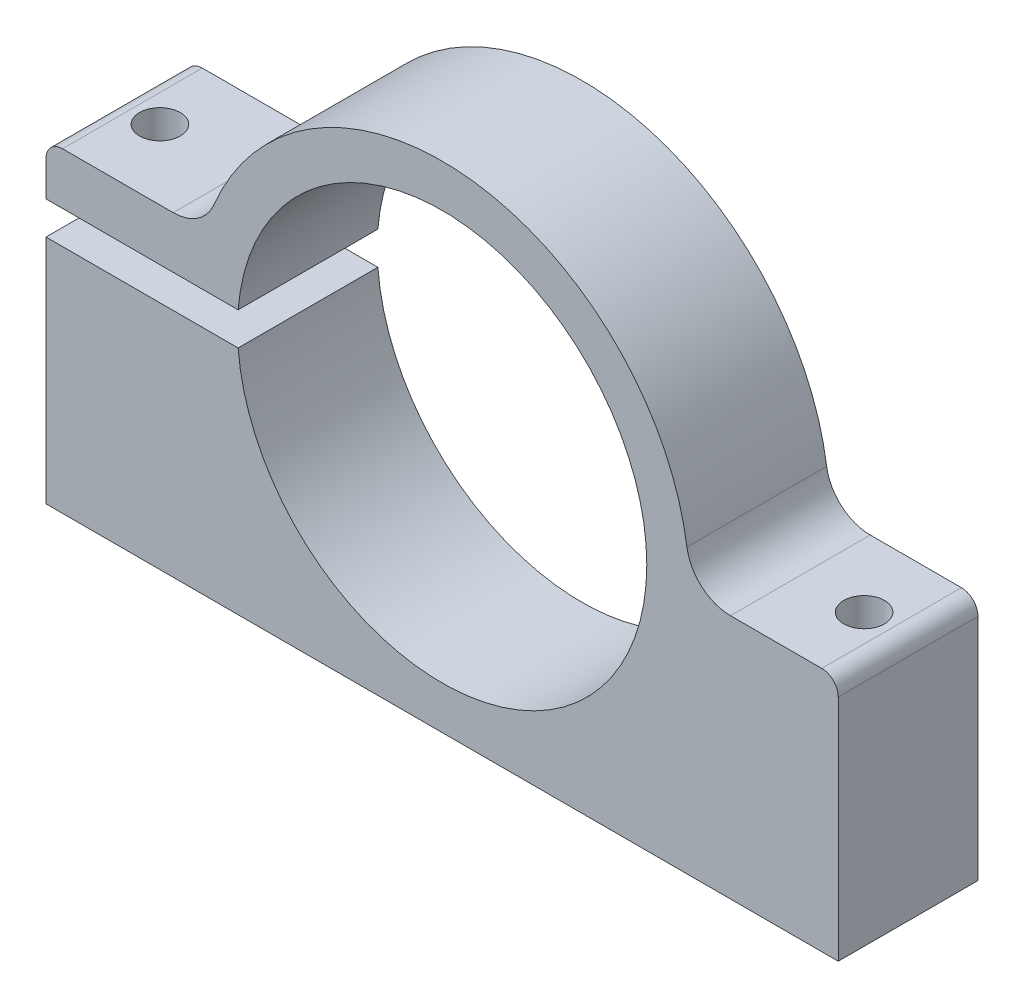
ISO-10303-21;
HEADER;
FILE_DESCRIPTION(('STEP AP214'),'2;1');
FILE_NAME('part.step','',(''),(''),'','','');
FILE_SCHEMA(('AUTOMOTIVE_DESIGN { 1 0 10303 214 1 1 1 1 }'));
ENDSEC;
DATA;
#1=APPLICATION_CONTEXT('core data for automotive mechanical design processes');
#2=APPLICATION_PROTOCOL_DEFINITION('international standard','automotive_design',2000,#1);
#3=PRODUCT_CONTEXT('',#1,'mechanical');
#4=PRODUCT('Part','Part','',(#3));
#5=PRODUCT_RELATED_PRODUCT_CATEGORY('part','',(#4));
#6=PRODUCT_DEFINITION_FORMATION('','',#4);
#7=PRODUCT_DEFINITION_CONTEXT('part definition',#1,'design');
#8=PRODUCT_DEFINITION('design','',#6,#7);
#9=PRODUCT_DEFINITION_SHAPE('','',#8);
#10=(LENGTH_UNIT() NAMED_UNIT(*) SI_UNIT(.MILLI.,.METRE.));
#11=(NAMED_UNIT(*) PLANE_ANGLE_UNIT() SI_UNIT($,.RADIAN.));
#12=(NAMED_UNIT(*) SI_UNIT($,.STERADIAN.) SOLID_ANGLE_UNIT());
#13=UNCERTAINTY_MEASURE_WITH_UNIT(LENGTH_MEASURE(1.E-05),#10,'distance_accuracy_value','');
#14=(GEOMETRIC_REPRESENTATION_CONTEXT(3) GLOBAL_UNCERTAINTY_ASSIGNED_CONTEXT((#13)) GLOBAL_UNIT_ASSIGNED_CONTEXT((#10,
#11,#12)) REPRESENTATION_CONTEXT('',''));
#15=CARTESIAN_POINT('',(0.,0.,0.));
#16=DIRECTION('',(0.,0.,1.));
#17=DIRECTION('',(1.,0.,0.));
#18=AXIS2_PLACEMENT_3D('',#15,#16,#17);
#19=CARTESIAN_POINT('',(0.,1.5,-6.35));
#20=DIRECTION('',(0.,1.,0.));
#21=DIRECTION('',(-1.,0.,0.));
#22=AXIS2_PLACEMENT_3D('',#19,#20,#21);
#23=PLANE('',#22);
#24=CARTESIAN_POINT('',(-32.,1.49999999999999,0.));
#25=DIRECTION('',(0.,1.,0.));
#26=DIRECTION('',(-1.,0.,0.));
#27=AXIS2_PLACEMENT_3D('',#24,#25,#26);
#28=CIRCLE('',#27,1.85);
#29=CARTESIAN_POINT('',(-33.85,1.49999999999999,0.));
#30=VERTEX_POINT('',#29);
#31=EDGE_CURVE('E152',#30,#30,#28,.T.);
#32=ORIENTED_EDGE('',*,*,#31,.T.);
#33=EDGE_LOOP('',(#32));
#34=FACE_BOUND('',#33,.T.);
#35=DIRECTION('',(-1.,0.,0.));
#36=VECTOR('',#35,1.);
#37=CARTESIAN_POINT('',(0.,1.5,-6.35));
#38=LINE('',#37,#36);
#39=CARTESIAN_POINT('',(-18.5394174665765,1.5,-6.35));
#40=VERTEX_POINT('',#39);
#41=CARTESIAN_POINT('',(-36.,1.5,-6.35));
#42=VERTEX_POINT('',#41);
#43=EDGE_CURVE('E148',#40,#42,#38,.T.);
#44=ORIENTED_EDGE('',*,*,#43,.F.);
#45=DIRECTION('',(0.,0.,1.));
#46=VECTOR('',#45,1.);
#47=CARTESIAN_POINT('',(-18.5394174665765,1.5,-6.35));
#48=LINE('',#47,#46);
#49=CARTESIAN_POINT('',(-18.5394174665765,1.5,6.35));
#50=VERTEX_POINT('',#49);
#51=EDGE_CURVE('E132',#40,#50,#48,.T.);
#52=ORIENTED_EDGE('',*,*,#51,.T.);
#53=DIRECTION('',(-1.,0.,0.));
#54=VECTOR('',#53,1.);
#55=CARTESIAN_POINT('',(0.,1.5,6.35));
#56=LINE('',#55,#54);
#57=CARTESIAN_POINT('',(-36.,1.5,6.35));
#58=VERTEX_POINT('',#57);
#59=EDGE_CURVE('E187',#50,#58,#56,.T.);
#60=ORIENTED_EDGE('',*,*,#59,.T.);
#61=DIRECTION('',(0.,0.,1.));
#62=VECTOR('',#61,1.);
#63=CARTESIAN_POINT('',(-36.,1.5,-6.35));
#64=LINE('',#63,#62);
#65=EDGE_CURVE('E155',#42,#58,#64,.T.);
#66=ORIENTED_EDGE('',*,*,#65,.F.);
#67=EDGE_LOOP('',(#44,#52,#60,#66));
#68=FACE_BOUND('',#67,.T.);
#69=ADVANCED_FACE('F32',(#34,#68),#23,.F.);
#70=CARTESIAN_POINT('',(-36.,1.5,-6.35));
#71=DIRECTION('',(1.,0.,0.));
#72=DIRECTION('',(0.,0.,-1.));
#73=AXIS2_PLACEMENT_3D('',#70,#71,#72);
#74=PLANE('',#73);
#75=DIRECTION('',(0.,1.,0.));
#76=VECTOR('',#75,1.);
#77=CARTESIAN_POINT('',(-36.,1.5,6.35));
#78=LINE('',#77,#76);
#79=CARTESIAN_POINT('',(-36.,4.69999999999999,6.35));
#80=VERTEX_POINT('',#79);
#81=EDGE_CURVE('E184',#58,#80,#78,.T.);
#82=ORIENTED_EDGE('',*,*,#81,.T.);
#83=DIRECTION('',(0.,0.,1.));
#84=VECTOR('',#83,1.);
#85=CARTESIAN_POINT('',(-36.,4.69999999999999,-6.35));
#86=LINE('',#85,#84);
#87=CARTESIAN_POINT('',(-36.,4.69999999999999,-6.35));
#88=VERTEX_POINT('',#87);
#89=EDGE_CURVE('E226',#80,#88,#86,.F.);
#90=ORIENTED_EDGE('',*,*,#89,.T.);
#91=DIRECTION('',(0.,1.,0.));
#92=VECTOR('',#91,1.);
#93=CARTESIAN_POINT('',(-36.,1.5,-6.35));
#94=LINE('',#93,#92);
#95=EDGE_CURVE('E158',#42,#88,#94,.T.);
#96=ORIENTED_EDGE('',*,*,#95,.F.);
#97=ORIENTED_EDGE('',*,*,#65,.T.);
#98=EDGE_LOOP('',(#82,#90,#96,#97));
#99=FACE_BOUND('',#98,.T.);
#100=ADVANCED_FACE('F285',(#99),#74,.F.);
#101=CARTESIAN_POINT('',(-36.,6.19999999999999,-6.35));
#102=DIRECTION('',(0.,-1.,0.));
#103=DIRECTION('',(0.,0.,-1.));
#104=AXIS2_PLACEMENT_3D('',#101,#102,#103);
#105=PLANE('',#104);
#106=CARTESIAN_POINT('',(-32.,6.2,0.));
#107=DIRECTION('',(0.,1.,0.));
#108=DIRECTION('',(-1.,0.,0.));
#109=AXIS2_PLACEMENT_3D('',#106,#107,#108);
#110=CIRCLE('',#109,1.85);
#111=CARTESIAN_POINT('',(-33.85,6.2,0.));
#112=VERTEX_POINT('',#111);
#113=EDGE_CURVE('E448',#112,#112,#110,.T.);
#114=ORIENTED_EDGE('',*,*,#113,.F.);
#115=EDGE_LOOP('',(#114));
#116=FACE_BOUND('',#115,.T.);
#117=DIRECTION('',(1.,0.,0.));
#118=VECTOR('',#117,1.);
#119=CARTESIAN_POINT('',(-36.,6.19999999999999,-6.35));
#120=LINE('',#119,#118);
#121=CARTESIAN_POINT('',(-34.5,6.19999999999999,-6.35));
#122=VERTEX_POINT('',#121);
#123=CARTESIAN_POINT('',(-24.4366609830394,6.19999999999999,-6.35));
#124=VERTEX_POINT('',#123);
#125=EDGE_CURVE('E163',#122,#124,#120,.T.);
#126=ORIENTED_EDGE('',*,*,#125,.F.);
#127=DIRECTION('',(0.,0.,1.));
#128=VECTOR('',#127,1.);
#129=CARTESIAN_POINT('',(-34.5,6.19999999999999,-6.35));
#130=LINE('',#129,#128);
#131=CARTESIAN_POINT('',(-34.5,6.19999999999999,6.35));
#132=VERTEX_POINT('',#131);
#133=EDGE_CURVE('E219',#122,#132,#130,.T.);
#134=ORIENTED_EDGE('',*,*,#133,.T.);
#135=DIRECTION('',(1.,0.,0.));
#136=VECTOR('',#135,1.);
#137=CARTESIAN_POINT('',(-36.,6.19999999999999,6.35));
#138=LINE('',#137,#136);
#139=CARTESIAN_POINT('',(-24.4366609830394,6.19999999999999,6.35));
#140=VERTEX_POINT('',#139);
#141=EDGE_CURVE('E182',#132,#140,#138,.T.);
#142=ORIENTED_EDGE('',*,*,#141,.T.);
#143=DIRECTION('',(0.,0.,1.));
#144=VECTOR('',#143,1.);
#145=CARTESIAN_POINT('',(-24.4366609830394,6.19999999999999,-6.35));
#146=LINE('',#145,#144);
#147=EDGE_CURVE('E203',#140,#124,#146,.F.);
#148=ORIENTED_EDGE('',*,*,#147,.T.);
#149=EDGE_LOOP('',(#126,#134,#142,#148));
#150=FACE_BOUND('',#149,.T.);
#151=ADVANCED_FACE('F264',(#116,#150),#105,.F.);
#152=CARTESIAN_POINT('',(0.,0.,-6.35));
#153=DIRECTION('',(0.,0.,1.));
#154=DIRECTION('',(1.,0.,0.));
#155=AXIS2_PLACEMENT_3D('',#152,#153,#154);
#156=CYLINDRICAL_SURFACE('',#155,22.48);
#157=CARTESIAN_POINT('',(0.,0.,-6.35));
#158=DIRECTION('',(0.,0.,1.));
#159=DIRECTION('',(1.,0.,0.));
#160=AXIS2_PLACEMENT_3D('',#157,#158,#159);
#161=CIRCLE('',#160,22.48);
#162=CARTESIAN_POINT('',(22.2473243549501,3.22598187311178,-6.35));
#163=VERTEX_POINT('',#162);
#164=CARTESIAN_POINT('',(-20.745322465964,8.65921450151057,-6.35));
#165=VERTEX_POINT('',#164);
#166=EDGE_CURVE('E250',#163,#165,#161,.T.);
#167=ORIENTED_EDGE('',*,*,#166,.T.);
#168=DIRECTION('',(0.,0.,1.));
#169=VECTOR('',#168,1.);
#170=CARTESIAN_POINT('',(-20.745322465964,8.65921450151057,-6.35));
#171=LINE('',#170,#169);
#172=CARTESIAN_POINT('',(-20.745322465964,8.65921450151057,6.35));
#173=VERTEX_POINT('',#172);
#174=EDGE_CURVE('E200',#165,#173,#171,.T.);
#175=ORIENTED_EDGE('',*,*,#174,.T.);
#176=CARTESIAN_POINT('',(0.,0.,6.35));
#177=DIRECTION('',(0.,0.,1.));
#178=DIRECTION('',(1.,0.,0.));
#179=AXIS2_PLACEMENT_3D('',#176,#177,#178);
#180=CIRCLE('',#179,22.48);
#181=CARTESIAN_POINT('',(22.2473243549501,3.22598187311178,6.35));
#182=VERTEX_POINT('',#181);
#183=EDGE_CURVE('E179',#182,#173,#180,.T.);
#184=ORIENTED_EDGE('',*,*,#183,.F.);
#185=DIRECTION('',(0.,0.,1.));
#186=VECTOR('',#185,1.);
#187=CARTESIAN_POINT('',(22.2473243549501,3.22598187311178,-6.35));
#188=LINE('',#187,#186);
#189=EDGE_CURVE('E194',#182,#163,#188,.F.);
#190=ORIENTED_EDGE('',*,*,#189,.T.);
#191=EDGE_LOOP('',(#167,#175,#184,#190));
#192=FACE_BOUND('',#191,.T.);
#193=ADVANCED_FACE('F270',(#192),#156,.T.);
#194=CARTESIAN_POINT('',(36.,-0.200000000000006,-6.35));
#195=DIRECTION('',(0.,1.,0.));
#196=DIRECTION('',(-1.,0.,0.));
#197=AXIS2_PLACEMENT_3D('',#194,#195,#196);
#198=PLANE('',#197);
#199=CARTESIAN_POINT('',(32.,-0.20000000000001,0.));
#200=DIRECTION('',(0.,1.,0.));
#201=DIRECTION('',(-1.,0.,0.));
#202=AXIS2_PLACEMENT_3D('',#199,#200,#201);
#203=CIRCLE('',#202,1.85);
#204=CARTESIAN_POINT('',(30.15,-0.20000000000001,0.));
#205=VERTEX_POINT('',#204);
#206=EDGE_CURVE('E446',#205,#205,#203,.T.);
#207=ORIENTED_EDGE('',*,*,#206,.F.);
#208=EDGE_LOOP('',(#207));
#209=FACE_BOUND('',#208,.T.);
#210=DIRECTION('',(-1.,0.,0.));
#211=VECTOR('',#210,1.);
#212=CARTESIAN_POINT('',(36.,-0.200000000000006,6.35));
#213=LINE('',#212,#211);
#214=CARTESIAN_POINT('',(34.5,-0.200000000000006,6.35));
#215=VERTEX_POINT('',#214);
#216=CARTESIAN_POINT('',(26.2059229946209,-0.200000000000007,6.35));
#217=VERTEX_POINT('',#216);
#218=EDGE_CURVE('E177',#215,#217,#213,.T.);
#219=ORIENTED_EDGE('',*,*,#218,.F.);
#220=DIRECTION('',(0.,0.,1.));
#221=VECTOR('',#220,1.);
#222=CARTESIAN_POINT('',(34.5,-0.200000000000006,-6.35));
#223=LINE('',#222,#221);
#224=CARTESIAN_POINT('',(34.5,-0.200000000000006,-6.35));
#225=VERTEX_POINT('',#224);
#226=EDGE_CURVE('E11',#215,#225,#223,.F.);
#227=ORIENTED_EDGE('',*,*,#226,.T.);
#228=DIRECTION('',(-1.,0.,0.));
#229=VECTOR('',#228,1.);
#230=CARTESIAN_POINT('',(36.,-0.200000000000006,-6.35));
#231=LINE('',#230,#229);
#232=CARTESIAN_POINT('',(26.2059229946209,-0.200000000000007,-6.35));
#233=VERTEX_POINT('',#232);
#234=EDGE_CURVE('E248',#225,#233,#231,.T.);
#235=ORIENTED_EDGE('',*,*,#234,.T.);
#236=DIRECTION('',(0.,0.,-1.));
#237=VECTOR('',#236,1.);
#238=CARTESIAN_POINT('',(26.2059229946209,-0.200000000000007,6.35));
#239=LINE('',#238,#237);
#240=EDGE_CURVE('E206',#233,#217,#239,.F.);
#241=ORIENTED_EDGE('',*,*,#240,.T.);
#242=EDGE_LOOP('',(#219,#227,#235,#241));
#243=FACE_BOUND('',#242,.T.);
#244=ADVANCED_FACE('F277',(#209,#243),#198,.T.);
#245=CARTESIAN_POINT('',(36.,-22.5,-6.35));
#246=DIRECTION('',(1.,0.,0.));
#247=DIRECTION('',(0.,1.,0.));
#248=AXIS2_PLACEMENT_3D('',#245,#246,#247);
#249=PLANE('',#248);
#250=DIRECTION('',(0.,1.,0.));
#251=VECTOR('',#250,1.);
#252=CARTESIAN_POINT('',(36.,-22.5,-6.35));
#253=LINE('',#252,#251);
#254=CARTESIAN_POINT('',(36.,-22.5,-6.35));
#255=VERTEX_POINT('',#254);
#256=CARTESIAN_POINT('',(36.,-1.70000000000001,-6.35));
#257=VERTEX_POINT('',#256);
#258=EDGE_CURVE('E235',#255,#257,#253,.T.);
#259=ORIENTED_EDGE('',*,*,#258,.T.);
#260=DIRECTION('',(0.,0.,1.));
#261=VECTOR('',#260,1.);
#262=CARTESIAN_POINT('',(36.,-1.70000000000001,-6.35));
#263=LINE('',#262,#261);
#264=CARTESIAN_POINT('',(36.,-1.70000000000001,6.35));
#265=VERTEX_POINT('',#264);
#266=EDGE_CURVE('E40',#257,#265,#263,.T.);
#267=ORIENTED_EDGE('',*,*,#266,.T.);
#268=DIRECTION('',(0.,1.,0.));
#269=VECTOR('',#268,1.);
#270=CARTESIAN_POINT('',(36.,-22.5,6.35));
#271=LINE('',#270,#269);
#272=CARTESIAN_POINT('',(36.,-22.5,6.35));
#273=VERTEX_POINT('',#272);
#274=EDGE_CURVE('E174',#273,#265,#271,.T.);
#275=ORIENTED_EDGE('',*,*,#274,.F.);
#276=DIRECTION('',(0.,0.,1.));
#277=VECTOR('',#276,1.);
#278=CARTESIAN_POINT('',(36.,-22.5,-6.35));
#279=LINE('',#278,#277);
#280=EDGE_CURVE('E190',#255,#273,#279,.T.);
#281=ORIENTED_EDGE('',*,*,#280,.F.);
#282=EDGE_LOOP('',(#259,#267,#275,#281));
#283=FACE_BOUND('',#282,.T.);
#284=ADVANCED_FACE('F234',(#283),#249,.T.);
#285=CARTESIAN_POINT('',(-36.,-22.5,-6.35));
#286=DIRECTION('',(0.,-1.,0.));
#287=DIRECTION('',(0.,0.,-1.));
#288=AXIS2_PLACEMENT_3D('',#285,#286,#287);
#289=PLANE('',#288);
#290=CARTESIAN_POINT('',(32.,-22.5,0.));
#291=DIRECTION('',(0.,1.,0.));
#292=DIRECTION('',(-1.,0.,0.));
#293=AXIS2_PLACEMENT_3D('',#290,#291,#292);
#294=CIRCLE('',#293,1.85);
#295=CARTESIAN_POINT('',(30.15,-22.5,0.));
#296=VERTEX_POINT('',#295);
#297=EDGE_CURVE('E443',#296,#296,#294,.T.);
#298=ORIENTED_EDGE('',*,*,#297,.T.);
#299=EDGE_LOOP('',(#298));
#300=FACE_BOUND('',#299,.T.);
#301=CARTESIAN_POINT('',(-32.,-22.5,0.));
#302=DIRECTION('',(0.,1.,0.));
#303=DIRECTION('',(-1.,0.,0.));
#304=AXIS2_PLACEMENT_3D('',#301,#302,#303);
#305=CIRCLE('',#304,1.85);
#306=CARTESIAN_POINT('',(-33.85,-22.5,0.));
#307=VERTEX_POINT('',#306);
#308=EDGE_CURVE('E198',#307,#307,#305,.T.);
#309=ORIENTED_EDGE('',*,*,#308,.T.);
#310=EDGE_LOOP('',(#309));
#311=FACE_BOUND('',#310,.T.);
#312=DIRECTION('',(1.,0.,0.));
#313=VECTOR('',#312,1.);
#314=CARTESIAN_POINT('',(-36.,-22.5,6.35));
#315=LINE('',#314,#313);
#316=CARTESIAN_POINT('',(-36.,-22.5,6.35));
#317=VERTEX_POINT('',#316);
#318=EDGE_CURVE('E171',#317,#273,#315,.T.);
#319=ORIENTED_EDGE('',*,*,#318,.F.);
#320=DIRECTION('',(0.,0.,1.));
#321=VECTOR('',#320,1.);
#322=CARTESIAN_POINT('',(-36.,-22.5,-6.35));
#323=LINE('',#322,#321);
#324=CARTESIAN_POINT('',(-36.,-22.5,-6.35));
#325=VERTEX_POINT('',#324);
#326=EDGE_CURVE('E161',#325,#317,#323,.T.);
#327=ORIENTED_EDGE('',*,*,#326,.F.);
#328=DIRECTION('',(1.,0.,0.));
#329=VECTOR('',#328,1.);
#330=CARTESIAN_POINT('',(-36.,-22.5,-6.35));
#331=LINE('',#330,#329);
#332=EDGE_CURVE('E246',#325,#255,#331,.T.);
#333=ORIENTED_EDGE('',*,*,#332,.T.);
#334=ORIENTED_EDGE('',*,*,#280,.T.);
#335=EDGE_LOOP('',(#319,#327,#333,#334));
#336=FACE_BOUND('',#335,.T.);
#337=ADVANCED_FACE('F243',(#300,#311,#336),#289,.T.);
#338=CARTESIAN_POINT('',(-36.,-1.5,-6.35));
#339=DIRECTION('',(-1.,0.,0.));
#340=DIRECTION('',(0.,-1.,0.));
#341=AXIS2_PLACEMENT_3D('',#338,#339,#340);
#342=PLANE('',#341);
#343=DIRECTION('',(0.,-1.,0.));
#344=VECTOR('',#343,1.);
#345=CARTESIAN_POINT('',(-36.,-1.5,6.35));
#346=LINE('',#345,#344);
#347=CARTESIAN_POINT('',(-36.,-1.5,6.35));
#348=VERTEX_POINT('',#347);
#349=EDGE_CURVE('E168',#348,#317,#346,.T.);
#350=ORIENTED_EDGE('',*,*,#349,.F.);
#351=DIRECTION('',(0.,0.,1.));
#352=VECTOR('',#351,1.);
#353=CARTESIAN_POINT('',(-36.,-1.5,-6.35));
#354=LINE('',#353,#352);
#355=CARTESIAN_POINT('',(-36.,-1.5,-6.35));
#356=VERTEX_POINT('',#355);
#357=EDGE_CURVE('E157',#356,#348,#354,.T.);
#358=ORIENTED_EDGE('',*,*,#357,.F.);
#359=DIRECTION('',(0.,-1.,0.));
#360=VECTOR('',#359,1.);
#361=CARTESIAN_POINT('',(-36.,-1.5,-6.35));
#362=LINE('',#361,#360);
#363=EDGE_CURVE('E252',#356,#325,#362,.T.);
#364=ORIENTED_EDGE('',*,*,#363,.T.);
#365=ORIENTED_EDGE('',*,*,#326,.T.);
#366=EDGE_LOOP('',(#350,#358,#364,#365));
#367=FACE_BOUND('',#366,.T.);
#368=ADVANCED_FACE('F309',(#367),#342,.T.);
#369=CARTESIAN_POINT('',(0.,-1.5,-6.35));
#370=DIRECTION('',(0.,1.,0.));
#371=DIRECTION('',(-1.,0.,0.));
#372=AXIS2_PLACEMENT_3D('',#369,#370,#371);
#373=PLANE('',#372);
#374=CARTESIAN_POINT('',(-32.,-1.5,0.));
#375=DIRECTION('',(0.,1.,0.));
#376=DIRECTION('',(-1.,0.,0.));
#377=AXIS2_PLACEMENT_3D('',#374,#375,#376);
#378=CIRCLE('',#377,1.85);
#379=CARTESIAN_POINT('',(-33.85,-1.5,0.));
#380=VERTEX_POINT('',#379);
#381=EDGE_CURVE('E195',#380,#380,#378,.T.);
#382=ORIENTED_EDGE('',*,*,#381,.F.);
#383=EDGE_LOOP('',(#382));
#384=FACE_BOUND('',#383,.T.);
#385=DIRECTION('',(0.,0.,1.));
#386=VECTOR('',#385,1.);
#387=CARTESIAN_POINT('',(-18.5394174665765,-1.5,-6.35));
#388=LINE('',#387,#386);
#389=CARTESIAN_POINT('',(-18.5394174665765,-1.5,-6.35));
#390=VERTEX_POINT('',#389);
#391=CARTESIAN_POINT('',(-18.5394174665765,-1.5,6.35));
#392=VERTEX_POINT('',#391);
#393=EDGE_CURVE('E143',#390,#392,#388,.T.);
#394=ORIENTED_EDGE('',*,*,#393,.F.);
#395=DIRECTION('',(-1.,0.,0.));
#396=VECTOR('',#395,1.);
#397=CARTESIAN_POINT('',(0.,-1.5,-6.35));
#398=LINE('',#397,#396);
#399=EDGE_CURVE('E151',#390,#356,#398,.T.);
#400=ORIENTED_EDGE('',*,*,#399,.T.);
#401=ORIENTED_EDGE('',*,*,#357,.T.);
#402=DIRECTION('',(-1.,0.,0.));
#403=VECTOR('',#402,1.);
#404=CARTESIAN_POINT('',(0.,-1.5,6.35));
#405=LINE('',#404,#403);
#406=EDGE_CURVE('E142',#392,#348,#405,.T.);
#407=ORIENTED_EDGE('',*,*,#406,.F.);
#408=EDGE_LOOP('',(#394,#400,#401,#407));
#409=FACE_BOUND('',#408,.T.);
#410=ADVANCED_FACE('F313',(#384,#409),#373,.T.);
#411=CARTESIAN_POINT('',(0.,0.,-6.35));
#412=DIRECTION('',(0.,0.,1.));
#413=DIRECTION('',(1.,0.,0.));
#414=AXIS2_PLACEMENT_3D('',#411,#412,#413);
#415=PLANE('',#414);
#416=ORIENTED_EDGE('',*,*,#95,.T.);
#417=CARTESIAN_POINT('',(-34.5,4.69999999999999,-6.35));
#418=DIRECTION('',(0.,0.,1.));
#419=DIRECTION('',(1.,0.,0.));
#420=AXIS2_PLACEMENT_3D('',#417,#418,#419);
#421=CIRCLE('',#420,1.5);
#422=EDGE_CURVE('E229',#88,#122,#421,.F.);
#423=ORIENTED_EDGE('',*,*,#422,.T.);
#424=ORIENTED_EDGE('',*,*,#125,.T.);
#425=CARTESIAN_POINT('',(-24.4366609830394,10.2,-6.35));
#426=DIRECTION('',(0.,0.,1.));
#427=DIRECTION('',(1.,0.,0.));
#428=AXIS2_PLACEMENT_3D('',#425,#426,#427);
#429=CIRCLE('',#428,4.);
#430=EDGE_CURVE('E212',#124,#165,#429,.T.);
#431=ORIENTED_EDGE('',*,*,#430,.T.);
#432=ORIENTED_EDGE('',*,*,#166,.F.);
#433=CARTESIAN_POINT('',(26.2059229946209,3.79999999999999,-6.35));
#434=DIRECTION('',(0.,0.,1.));
#435=DIRECTION('',(1.,0.,0.));
#436=AXIS2_PLACEMENT_3D('',#433,#434,#435);
#437=CIRCLE('',#436,4.);
#438=EDGE_CURVE('E216',#163,#233,#437,.T.);
#439=ORIENTED_EDGE('',*,*,#438,.T.);
#440=ORIENTED_EDGE('',*,*,#234,.F.);
#441=CARTESIAN_POINT('',(34.5,-1.70000000000001,-6.35));
#442=DIRECTION('',(0.,0.,1.));
#443=DIRECTION('',(1.,0.,0.));
#444=AXIS2_PLACEMENT_3D('',#441,#442,#443);
#445=CIRCLE('',#444,1.5);
#446=EDGE_CURVE('E47',#225,#257,#445,.F.);
#447=ORIENTED_EDGE('',*,*,#446,.T.);
#448=ORIENTED_EDGE('',*,*,#258,.F.);
#449=ORIENTED_EDGE('',*,*,#332,.F.);
#450=ORIENTED_EDGE('',*,*,#363,.F.);
#451=ORIENTED_EDGE('',*,*,#399,.F.);
#452=CARTESIAN_POINT('',(0.,0.,-6.35));
#453=DIRECTION('',(0.,0.,1.));
#454=DIRECTION('',(1.,0.,0.));
#455=AXIS2_PLACEMENT_3D('',#452,#453,#454);
#456=CIRCLE('',#455,18.6);
#457=EDGE_CURVE('E135',#390,#40,#456,.T.);
#458=ORIENTED_EDGE('',*,*,#457,.T.);
#459=ORIENTED_EDGE('',*,*,#43,.T.);
#460=EDGE_LOOP('',(#416,#423,#424,#431,#432,#439,#440,#447,#448,#449,#450,#451,#458,#459));
#461=FACE_BOUND('',#460,.T.);
#462=ADVANCED_FACE('F147',(#461),#415,.F.);
#463=CARTESIAN_POINT('',(0.,0.,6.35));
#464=DIRECTION('',(0.,0.,1.));
#465=DIRECTION('',(1.,0.,0.));
#466=AXIS2_PLACEMENT_3D('',#463,#464,#465);
#467=PLANE('',#466);
#468=ORIENTED_EDGE('',*,*,#141,.F.);
#469=CARTESIAN_POINT('',(-34.5,4.69999999999999,6.35));
#470=DIRECTION('',(0.,0.,1.));
#471=DIRECTION('',(1.,0.,0.));
#472=AXIS2_PLACEMENT_3D('',#469,#470,#471);
#473=CIRCLE('',#472,1.5);
#474=EDGE_CURVE('E224',#132,#80,#473,.T.);
#475=ORIENTED_EDGE('',*,*,#474,.T.);
#476=ORIENTED_EDGE('',*,*,#81,.F.);
#477=ORIENTED_EDGE('',*,*,#59,.F.);
#478=CARTESIAN_POINT('',(0.,0.,6.35));
#479=DIRECTION('',(0.,0.,1.));
#480=DIRECTION('',(1.,0.,0.));
#481=AXIS2_PLACEMENT_3D('',#478,#479,#480);
#482=CIRCLE('',#481,18.6);
#483=EDGE_CURVE('E138',#392,#50,#482,.T.);
#484=ORIENTED_EDGE('',*,*,#483,.F.);
#485=ORIENTED_EDGE('',*,*,#406,.T.);
#486=ORIENTED_EDGE('',*,*,#349,.T.);
#487=ORIENTED_EDGE('',*,*,#318,.T.);
#488=ORIENTED_EDGE('',*,*,#274,.T.);
#489=CARTESIAN_POINT('',(34.5,-1.70000000000001,6.35));
#490=DIRECTION('',(0.,0.,1.));
#491=DIRECTION('',(1.,0.,0.));
#492=AXIS2_PLACEMENT_3D('',#489,#490,#491);
#493=CIRCLE('',#492,1.5);
#494=EDGE_CURVE('E222',#265,#215,#493,.T.);
#495=ORIENTED_EDGE('',*,*,#494,.T.);
#496=ORIENTED_EDGE('',*,*,#218,.T.);
#497=CARTESIAN_POINT('',(26.2059229946209,3.79999999999999,6.35));
#498=DIRECTION('',(0.,0.,1.));
#499=DIRECTION('',(1.,0.,0.));
#500=AXIS2_PLACEMENT_3D('',#497,#498,#499);
#501=CIRCLE('',#500,4.);
#502=EDGE_CURVE('E214',#217,#182,#501,.F.);
#503=ORIENTED_EDGE('',*,*,#502,.T.);
#504=ORIENTED_EDGE('',*,*,#183,.T.);
#505=CARTESIAN_POINT('',(-24.4366609830394,10.2,6.35));
#506=DIRECTION('',(0.,0.,1.));
#507=DIRECTION('',(1.,0.,0.));
#508=AXIS2_PLACEMENT_3D('',#505,#506,#507);
#509=CIRCLE('',#508,4.);
#510=EDGE_CURVE('E209',#173,#140,#509,.F.);
#511=ORIENTED_EDGE('',*,*,#510,.T.);
#512=EDGE_LOOP('',(#468,#475,#476,#477,#484,#485,#486,#487,#488,#495,#496,#503,#504,#511));
#513=FACE_BOUND('',#512,.T.);
#514=ADVANCED_FACE('F239',(#513),#467,.T.);
#515=CARTESIAN_POINT('',(0.,0.,-6.35));
#516=DIRECTION('',(0.,0.,1.));
#517=DIRECTION('',(1.,0.,0.));
#518=AXIS2_PLACEMENT_3D('',#515,#516,#517);
#519=CYLINDRICAL_SURFACE('',#518,18.6);
#520=ORIENTED_EDGE('',*,*,#457,.F.);
#521=ORIENTED_EDGE('',*,*,#393,.T.);
#522=ORIENTED_EDGE('',*,*,#483,.T.);
#523=ORIENTED_EDGE('',*,*,#51,.F.);
#524=EDGE_LOOP('',(#520,#521,#522,#523));
#525=FACE_BOUND('',#524,.T.);
#526=ADVANCED_FACE('F134',(#525),#519,.F.);
#527=CARTESIAN_POINT('',(-32.,-22.5,0.));
#528=DIRECTION('',(0.,1.,0.));
#529=DIRECTION('',(-1.,0.,0.));
#530=AXIS2_PLACEMENT_3D('',#527,#528,#529);
#531=CYLINDRICAL_SURFACE('',#530,1.85);
#532=ORIENTED_EDGE('',*,*,#381,.T.);
#533=EDGE_LOOP('',(#532));
#534=FACE_BOUND('',#533,.T.);
#535=ORIENTED_EDGE('',*,*,#308,.F.);
#536=EDGE_LOOP('',(#535));
#537=FACE_BOUND('',#536,.T.);
#538=ADVANCED_FACE('F396',(#534,#537),#531,.F.);
#539=ORIENTED_EDGE('',*,*,#113,.T.);
#540=EDGE_LOOP('',(#539));
#541=FACE_BOUND('',#540,.T.);
#542=ORIENTED_EDGE('',*,*,#31,.F.);
#543=EDGE_LOOP('',(#542));
#544=FACE_BOUND('',#543,.T.);
#545=ADVANCED_FACE('F401',(#541,#544),#531,.F.);
#546=CARTESIAN_POINT('',(32.,-22.5,0.));
#547=DIRECTION('',(0.,1.,0.));
#548=DIRECTION('',(-1.,0.,0.));
#549=AXIS2_PLACEMENT_3D('',#546,#547,#548);
#550=CYLINDRICAL_SURFACE('',#549,1.85);
#551=ORIENTED_EDGE('',*,*,#297,.F.);
#552=EDGE_LOOP('',(#551));
#553=FACE_BOUND('',#552,.T.);
#554=ORIENTED_EDGE('',*,*,#206,.T.);
#555=EDGE_LOOP('',(#554));
#556=FACE_BOUND('',#555,.T.);
#557=ADVANCED_FACE('F320',(#553,#556),#550,.F.);
#558=CARTESIAN_POINT('',(-24.4366609830394,10.2,-6.35));
#559=DIRECTION('',(0.,0.,1.));
#560=DIRECTION('',(1.,0.,0.));
#561=AXIS2_PLACEMENT_3D('',#558,#559,#560);
#562=CYLINDRICAL_SURFACE('',#561,4.);
#563=ORIENTED_EDGE('',*,*,#430,.F.);
#564=ORIENTED_EDGE('',*,*,#147,.F.);
#565=ORIENTED_EDGE('',*,*,#510,.F.);
#566=ORIENTED_EDGE('',*,*,#174,.F.);
#567=EDGE_LOOP('',(#563,#564,#565,#566));
#568=FACE_BOUND('',#567,.T.);
#569=ADVANCED_FACE('F267',(#568),#562,.F.);
#570=CARTESIAN_POINT('',(26.2059229946209,3.79999999999999,-6.35));
#571=DIRECTION('',(0.,0.,1.));
#572=DIRECTION('',(1.,0.,0.));
#573=AXIS2_PLACEMENT_3D('',#570,#571,#572);
#574=CYLINDRICAL_SURFACE('',#573,4.);
#575=ORIENTED_EDGE('',*,*,#438,.F.);
#576=ORIENTED_EDGE('',*,*,#189,.F.);
#577=ORIENTED_EDGE('',*,*,#502,.F.);
#578=ORIENTED_EDGE('',*,*,#240,.F.);
#579=EDGE_LOOP('',(#575,#576,#577,#578));
#580=FACE_BOUND('',#579,.T.);
#581=ADVANCED_FACE('F276',(#580),#574,.F.);
#582=CARTESIAN_POINT('',(-34.5,4.69999999999999,-6.35));
#583=DIRECTION('',(0.,0.,1.));
#584=DIRECTION('',(1.,0.,0.));
#585=AXIS2_PLACEMENT_3D('',#582,#583,#584);
#586=CYLINDRICAL_SURFACE('',#585,1.5);
#587=ORIENTED_EDGE('',*,*,#422,.F.);
#588=ORIENTED_EDGE('',*,*,#89,.F.);
#589=ORIENTED_EDGE('',*,*,#474,.F.);
#590=ORIENTED_EDGE('',*,*,#133,.F.);
#591=EDGE_LOOP('',(#587,#588,#589,#590));
#592=FACE_BOUND('',#591,.T.);
#593=ADVANCED_FACE('F279',(#592),#586,.T.);
#594=CARTESIAN_POINT('',(34.5,-1.70000000000001,-6.35));
#595=DIRECTION('',(0.,0.,1.));
#596=DIRECTION('',(1.,0.,0.));
#597=AXIS2_PLACEMENT_3D('',#594,#595,#596);
#598=CYLINDRICAL_SURFACE('',#597,1.5);
#599=ORIENTED_EDGE('',*,*,#446,.F.);
#600=ORIENTED_EDGE('',*,*,#226,.F.);
#601=ORIENTED_EDGE('',*,*,#494,.F.);
#602=ORIENTED_EDGE('',*,*,#266,.F.);
#603=EDGE_LOOP('',(#599,#600,#601,#602));
#604=FACE_BOUND('',#603,.T.);
#605=ADVANCED_FACE('F34',(#604),#598,.T.);
#606=CLOSED_SHELL('',(#69,#100,#151,#193,#244,#284,#337,#368,#410,#462,#514,#526,#538,#545,#557,
#569,#581,#593,#605));
#607=MANIFOLD_SOLID_BREP('B2',#606);
#608=ADVANCED_BREP_SHAPE_REPRESENTATION('',(#18,#607),#14);
#609=SHAPE_DEFINITION_REPRESENTATION(#9,#608);
ENDSEC;
END-ISO-10303-21;
